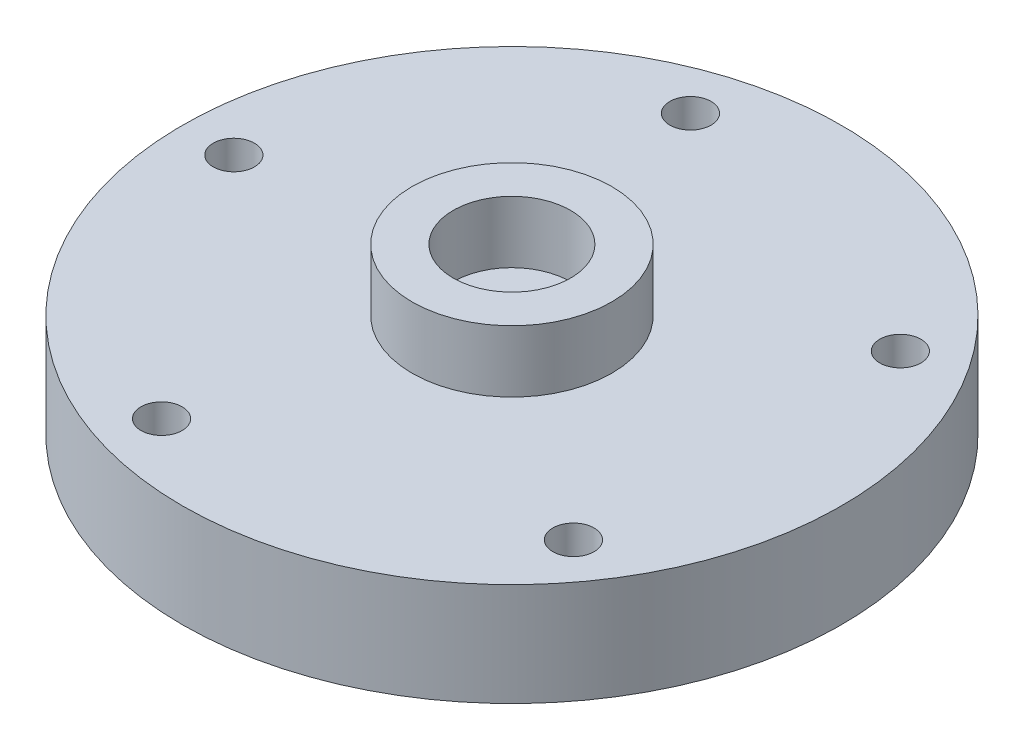
ISO-10303-21;
HEADER;
FILE_DESCRIPTION(('STEP AP214'),'2;1');
FILE_NAME('part.step','',(''),(''),'','','');
FILE_SCHEMA(('AUTOMOTIVE_DESIGN { 1 0 10303 214 1 1 1 1 }'));
ENDSEC;
DATA;
#1=APPLICATION_CONTEXT('core data for automotive mechanical design processes');
#2=APPLICATION_PROTOCOL_DEFINITION('international standard','automotive_design',2000,#1);
#3=PRODUCT_CONTEXT('',#1,'mechanical');
#4=PRODUCT('Part','Part','',(#3));
#5=PRODUCT_RELATED_PRODUCT_CATEGORY('part','',(#4));
#6=PRODUCT_DEFINITION_FORMATION('','',#4);
#7=PRODUCT_DEFINITION_CONTEXT('part definition',#1,'design');
#8=PRODUCT_DEFINITION('design','',#6,#7);
#9=PRODUCT_DEFINITION_SHAPE('','',#8);
#10=(LENGTH_UNIT() NAMED_UNIT(*) SI_UNIT(.MILLI.,.METRE.));
#11=(NAMED_UNIT(*) PLANE_ANGLE_UNIT() SI_UNIT($,.RADIAN.));
#12=(NAMED_UNIT(*) SI_UNIT($,.STERADIAN.) SOLID_ANGLE_UNIT());
#13=UNCERTAINTY_MEASURE_WITH_UNIT(LENGTH_MEASURE(1.E-05),#10,'distance_accuracy_value','');
#14=(GEOMETRIC_REPRESENTATION_CONTEXT(3) GLOBAL_UNCERTAINTY_ASSIGNED_CONTEXT((#13)) GLOBAL_UNIT_ASSIGNED_CONTEXT((#10,
#11,#12)) REPRESENTATION_CONTEXT('',''));
#15=CARTESIAN_POINT('',(0.,0.,0.));
#16=DIRECTION('',(0.,0.,1.));
#17=DIRECTION('',(1.,0.,0.));
#18=AXIS2_PLACEMENT_3D('',#15,#16,#17);
#19=CARTESIAN_POINT('',(0.,-3.,0.));
#20=DIRECTION('',(0.,1.,0.));
#21=DIRECTION('',(0.,0.,1.));
#22=AXIS2_PLACEMENT_3D('',#19,#20,#21);
#23=CYLINDRICAL_SURFACE('',#22,1.);
#24=CARTESIAN_POINT('',(0.,2.,0.));
#25=DIRECTION('',(0.,1.,0.));
#26=DIRECTION('',(0.,0.,1.));
#27=AXIS2_PLACEMENT_3D('',#24,#25,#26);
#28=CIRCLE('',#27,1.);
#29=CARTESIAN_POINT('',(0.,2.,1.));
#30=VERTEX_POINT('',#29);
#31=EDGE_CURVE('E79',#30,#30,#28,.T.);
#32=ORIENTED_EDGE('',*,*,#31,.T.);
#33=EDGE_LOOP('',(#32));
#34=FACE_BOUND('',#33,.T.);
#35=CARTESIAN_POINT('',(0.,-2.,0.));
#36=DIRECTION('',(0.,-1.,0.));
#37=DIRECTION('',(0.,0.,-1.));
#38=AXIS2_PLACEMENT_3D('',#35,#36,#37);
#39=CIRCLE('',#38,1.);
#40=CARTESIAN_POINT('',(0.,-2.,-1.));
#41=VERTEX_POINT('',#40);
#42=EDGE_CURVE('E36',#41,#41,#39,.F.);
#43=ORIENTED_EDGE('',*,*,#42,.F.);
#44=EDGE_LOOP('',(#43));
#45=FACE_BOUND('',#44,.T.);
#46=ADVANCED_FACE('F33',(#34,#45),#23,.F.);
#47=CARTESIAN_POINT('',(0.,2.,0.));
#48=DIRECTION('',(0.,1.,0.));
#49=DIRECTION('',(0.,0.,1.));
#50=AXIS2_PLACEMENT_3D('',#47,#48,#49);
#51=PLANE('',#50);
#52=ORIENTED_EDGE('',*,*,#31,.F.);
#53=EDGE_LOOP('',(#52));
#54=FACE_BOUND('',#53,.T.);
#55=CARTESIAN_POINT('',(0.,2.,0.));
#56=DIRECTION('',(0.,1.,0.));
#57=DIRECTION('',(0.,0.,1.));
#58=AXIS2_PLACEMENT_3D('',#55,#56,#57);
#59=CIRCLE('',#58,2.85);
#60=CARTESIAN_POINT('',(0.,2.,2.85));
#61=VERTEX_POINT('',#60);
#62=EDGE_CURVE('E10',#61,#61,#59,.F.);
#63=ORIENTED_EDGE('',*,*,#62,.F.);
#64=EDGE_LOOP('',(#63));
#65=FACE_BOUND('',#64,.T.);
#66=ADVANCED_FACE('F104',(#54,#65),#51,.T.);
#67=CARTESIAN_POINT('',(10.9217294240618,-3.,7.93510090594839));
#68=DIRECTION('',(0.,1.,0.));
#69=DIRECTION('',(0.,0.,1.));
#70=AXIS2_PLACEMENT_3D('',#67,#68,#69);
#71=CYLINDRICAL_SURFACE('',#70,1.);
#72=CARTESIAN_POINT('',(10.9217294240618,-3.,7.93510090594839));
#73=DIRECTION('',(0.,1.,0.));
#74=DIRECTION('',(0.,0.,1.));
#75=AXIS2_PLACEMENT_3D('',#72,#73,#74);
#76=CIRCLE('',#75,1.);
#77=CARTESIAN_POINT('',(10.9217294240618,-3.,8.93510090594839));
#78=VERTEX_POINT('',#77);
#79=EDGE_CURVE('E44',#78,#78,#76,.T.);
#80=ORIENTED_EDGE('',*,*,#79,.F.);
#81=EDGE_LOOP('',(#80));
#82=FACE_BOUND('',#81,.T.);
#83=CARTESIAN_POINT('',(10.9217294240618,2.,7.93510090594839));
#84=DIRECTION('',(0.,1.,0.));
#85=DIRECTION('',(0.,0.,1.));
#86=AXIS2_PLACEMENT_3D('',#83,#84,#85);
#87=CIRCLE('',#86,1.);
#88=CARTESIAN_POINT('',(10.9217294240618,2.,8.93510090594839));
#89=VERTEX_POINT('',#88);
#90=EDGE_CURVE('E64',#89,#89,#87,.T.);
#91=ORIENTED_EDGE('',*,*,#90,.T.);
#92=EDGE_LOOP('',(#91));
#93=FACE_BOUND('',#92,.T.);
#94=ADVANCED_FACE('F109',(#82,#93),#71,.F.);
#95=CARTESIAN_POINT('',(10.9217294240618,-3.,-7.93510090594839));
#96=DIRECTION('',(0.,1.,0.));
#97=DIRECTION('',(0.,0.,1.));
#98=AXIS2_PLACEMENT_3D('',#95,#96,#97);
#99=CYLINDRICAL_SURFACE('',#98,1.);
#100=CARTESIAN_POINT('',(10.9217294240618,-3.,-7.93510090594839));
#101=DIRECTION('',(0.,1.,0.));
#102=DIRECTION('',(0.,0.,1.));
#103=AXIS2_PLACEMENT_3D('',#100,#101,#102);
#104=CIRCLE('',#103,1.);
#105=CARTESIAN_POINT('',(10.9217294240618,-3.,-6.93510090594839));
#106=VERTEX_POINT('',#105);
#107=EDGE_CURVE('E49',#106,#106,#104,.T.);
#108=ORIENTED_EDGE('',*,*,#107,.F.);
#109=EDGE_LOOP('',(#108));
#110=FACE_BOUND('',#109,.T.);
#111=CARTESIAN_POINT('',(10.9217294240618,2.,-7.93510090594839));
#112=DIRECTION('',(0.,1.,0.));
#113=DIRECTION('',(0.,0.,1.));
#114=AXIS2_PLACEMENT_3D('',#111,#112,#113);
#115=CIRCLE('',#114,1.);
#116=CARTESIAN_POINT('',(10.9217294240618,2.,-6.93510090594839));
#117=VERTEX_POINT('',#116);
#118=EDGE_CURVE('E67',#117,#117,#115,.T.);
#119=ORIENTED_EDGE('',*,*,#118,.T.);
#120=EDGE_LOOP('',(#119));
#121=FACE_BOUND('',#120,.T.);
#122=ADVANCED_FACE('F118',(#110,#121),#99,.F.);
#123=CARTESIAN_POINT('',(-4.17172942406179,-3.,-12.8392629699846));
#124=DIRECTION('',(0.,1.,0.));
#125=DIRECTION('',(0.,0.,1.));
#126=AXIS2_PLACEMENT_3D('',#123,#124,#125);
#127=CYLINDRICAL_SURFACE('',#126,1.);
#128=CARTESIAN_POINT('',(-4.17172942406179,-3.,-12.8392629699846));
#129=DIRECTION('',(0.,1.,0.));
#130=DIRECTION('',(0.,0.,1.));
#131=AXIS2_PLACEMENT_3D('',#128,#129,#130);
#132=CIRCLE('',#131,1.);
#133=CARTESIAN_POINT('',(-4.17172942406179,-3.,-11.8392629699846));
#134=VERTEX_POINT('',#133);
#135=EDGE_CURVE('E52',#134,#134,#132,.T.);
#136=ORIENTED_EDGE('',*,*,#135,.F.);
#137=EDGE_LOOP('',(#136));
#138=FACE_BOUND('',#137,.T.);
#139=CARTESIAN_POINT('',(-4.17172942406179,2.,-12.8392629699846));
#140=DIRECTION('',(0.,1.,0.));
#141=DIRECTION('',(0.,0.,1.));
#142=AXIS2_PLACEMENT_3D('',#139,#140,#141);
#143=CIRCLE('',#142,1.);
#144=CARTESIAN_POINT('',(-4.17172942406179,2.,-11.8392629699846));
#145=VERTEX_POINT('',#144);
#146=EDGE_CURVE('E70',#145,#145,#143,.T.);
#147=ORIENTED_EDGE('',*,*,#146,.T.);
#148=EDGE_LOOP('',(#147));
#149=FACE_BOUND('',#148,.T.);
#150=ADVANCED_FACE('F161',(#138,#149),#127,.F.);
#151=CARTESIAN_POINT('',(-13.5,-3.,0.));
#152=DIRECTION('',(0.,1.,0.));
#153=DIRECTION('',(0.,0.,1.));
#154=AXIS2_PLACEMENT_3D('',#151,#152,#153);
#155=CYLINDRICAL_SURFACE('',#154,1.);
#156=CARTESIAN_POINT('',(-13.5,-3.,0.));
#157=DIRECTION('',(0.,1.,0.));
#158=DIRECTION('',(0.,0.,1.));
#159=AXIS2_PLACEMENT_3D('',#156,#157,#158);
#160=CIRCLE('',#159,1.);
#161=CARTESIAN_POINT('',(-13.5,-3.,1.));
#162=VERTEX_POINT('',#161);
#163=EDGE_CURVE('E55',#162,#162,#160,.T.);
#164=ORIENTED_EDGE('',*,*,#163,.F.);
#165=EDGE_LOOP('',(#164));
#166=FACE_BOUND('',#165,.T.);
#167=CARTESIAN_POINT('',(-13.5,2.,0.));
#168=DIRECTION('',(0.,1.,0.));
#169=DIRECTION('',(0.,0.,1.));
#170=AXIS2_PLACEMENT_3D('',#167,#168,#169);
#171=CIRCLE('',#170,1.);
#172=CARTESIAN_POINT('',(-13.5,2.,1.));
#173=VERTEX_POINT('',#172);
#174=EDGE_CURVE('E73',#173,#173,#171,.T.);
#175=ORIENTED_EDGE('',*,*,#174,.T.);
#176=EDGE_LOOP('',(#175));
#177=FACE_BOUND('',#176,.T.);
#178=ADVANCED_FACE('F156',(#166,#177),#155,.F.);
#179=CARTESIAN_POINT('',(-4.17172942406179,-3.,12.8392629699846));
#180=DIRECTION('',(0.,1.,0.));
#181=DIRECTION('',(0.,0.,1.));
#182=AXIS2_PLACEMENT_3D('',#179,#180,#181);
#183=CYLINDRICAL_SURFACE('',#182,1.);
#184=CARTESIAN_POINT('',(-4.17172942406179,-3.,12.8392629699846));
#185=DIRECTION('',(0.,1.,0.));
#186=DIRECTION('',(0.,0.,1.));
#187=AXIS2_PLACEMENT_3D('',#184,#185,#186);
#188=CIRCLE('',#187,1.);
#189=CARTESIAN_POINT('',(-4.17172942406179,-3.,13.8392629699846));
#190=VERTEX_POINT('',#189);
#191=EDGE_CURVE('E58',#190,#190,#188,.T.);
#192=ORIENTED_EDGE('',*,*,#191,.F.);
#193=EDGE_LOOP('',(#192));
#194=FACE_BOUND('',#193,.T.);
#195=CARTESIAN_POINT('',(-4.17172942406179,2.,12.8392629699846));
#196=DIRECTION('',(0.,1.,0.));
#197=DIRECTION('',(0.,0.,1.));
#198=AXIS2_PLACEMENT_3D('',#195,#196,#197);
#199=CIRCLE('',#198,1.);
#200=CARTESIAN_POINT('',(-4.17172942406179,2.,13.8392629699846));
#201=VERTEX_POINT('',#200);
#202=EDGE_CURVE('E76',#201,#201,#199,.T.);
#203=ORIENTED_EDGE('',*,*,#202,.T.);
#204=EDGE_LOOP('',(#203));
#205=FACE_BOUND('',#204,.T.);
#206=ADVANCED_FACE('F150',(#194,#205),#183,.F.);
#207=CARTESIAN_POINT('',(0.,-3.,0.));
#208=DIRECTION('',(0.,1.,0.));
#209=DIRECTION('',(0.,0.,1.));
#210=AXIS2_PLACEMENT_3D('',#207,#208,#209);
#211=CYLINDRICAL_SURFACE('',#210,16.);
#212=CARTESIAN_POINT('',(0.,-3.,0.));
#213=DIRECTION('',(0.,1.,0.));
#214=DIRECTION('',(0.,0.,1.));
#215=AXIS2_PLACEMENT_3D('',#212,#213,#214);
#216=CIRCLE('',#215,16.);
#217=CARTESIAN_POINT('',(0.,-3.,16.));
#218=VERTEX_POINT('',#217);
#219=EDGE_CURVE('E40',#218,#218,#216,.T.);
#220=ORIENTED_EDGE('',*,*,#219,.T.);
#221=EDGE_LOOP('',(#220));
#222=FACE_BOUND('',#221,.T.);
#223=CARTESIAN_POINT('',(0.,2.,0.));
#224=DIRECTION('',(0.,1.,0.));
#225=DIRECTION('',(0.,0.,1.));
#226=AXIS2_PLACEMENT_3D('',#223,#224,#225);
#227=CIRCLE('',#226,16.);
#228=CARTESIAN_POINT('',(0.,2.,16.));
#229=VERTEX_POINT('',#228);
#230=EDGE_CURVE('E61',#229,#229,#227,.T.);
#231=ORIENTED_EDGE('',*,*,#230,.F.);
#232=EDGE_LOOP('',(#231));
#233=FACE_BOUND('',#232,.T.);
#234=ADVANCED_FACE('F133',(#222,#233),#211,.T.);
#235=CARTESIAN_POINT('',(0.,-3.,0.));
#236=DIRECTION('',(0.,1.,0.));
#237=DIRECTION('',(0.,0.,1.));
#238=AXIS2_PLACEMENT_3D('',#235,#236,#237);
#239=PLANE('',#238);
#240=CARTESIAN_POINT('',(0.,-3.,0.));
#241=DIRECTION('',(0.,-1.,0.));
#242=DIRECTION('',(0.,0.,-1.));
#243=AXIS2_PLACEMENT_3D('',#240,#241,#242);
#244=CIRCLE('',#243,2.);
#245=CARTESIAN_POINT('',(0.,-3.,-2.));
#246=VERTEX_POINT('',#245);
#247=EDGE_CURVE('E91',#246,#246,#244,.T.);
#248=ORIENTED_EDGE('',*,*,#247,.F.);
#249=EDGE_LOOP('',(#248));
#250=FACE_BOUND('',#249,.T.);
#251=ORIENTED_EDGE('',*,*,#191,.T.);
#252=EDGE_LOOP('',(#251));
#253=FACE_BOUND('',#252,.T.);
#254=ORIENTED_EDGE('',*,*,#163,.T.);
#255=EDGE_LOOP('',(#254));
#256=FACE_BOUND('',#255,.T.);
#257=ORIENTED_EDGE('',*,*,#135,.T.);
#258=EDGE_LOOP('',(#257));
#259=FACE_BOUND('',#258,.T.);
#260=ORIENTED_EDGE('',*,*,#107,.T.);
#261=EDGE_LOOP('',(#260));
#262=FACE_BOUND('',#261,.T.);
#263=ORIENTED_EDGE('',*,*,#79,.T.);
#264=EDGE_LOOP('',(#263));
#265=FACE_BOUND('',#264,.T.);
#266=ORIENTED_EDGE('',*,*,#219,.F.);
#267=EDGE_LOOP('',(#266));
#268=FACE_BOUND('',#267,.T.);
#269=ADVANCED_FACE('F125',(#250,#253,#256,#259,#262,#265,#268),#239,.F.);
#270=CARTESIAN_POINT('',(0.,2.,0.));
#271=DIRECTION('',(0.,1.,0.));
#272=DIRECTION('',(0.,0.,1.));
#273=AXIS2_PLACEMENT_3D('',#270,#271,#272);
#274=CIRCLE('',#273,4.85);
#275=CARTESIAN_POINT('',(0.,2.,4.85));
#276=VERTEX_POINT('',#275);
#277=EDGE_CURVE('E83',#276,#276,#274,.T.);
#278=ORIENTED_EDGE('',*,*,#277,.F.);
#279=EDGE_LOOP('',(#278));
#280=FACE_BOUND('',#279,.T.);
#281=ORIENTED_EDGE('',*,*,#202,.F.);
#282=EDGE_LOOP('',(#281));
#283=FACE_BOUND('',#282,.T.);
#284=ORIENTED_EDGE('',*,*,#174,.F.);
#285=EDGE_LOOP('',(#284));
#286=FACE_BOUND('',#285,.T.);
#287=ORIENTED_EDGE('',*,*,#146,.F.);
#288=EDGE_LOOP('',(#287));
#289=FACE_BOUND('',#288,.T.);
#290=ORIENTED_EDGE('',*,*,#118,.F.);
#291=EDGE_LOOP('',(#290));
#292=FACE_BOUND('',#291,.T.);
#293=ORIENTED_EDGE('',*,*,#90,.F.);
#294=EDGE_LOOP('',(#293));
#295=FACE_BOUND('',#294,.T.);
#296=ORIENTED_EDGE('',*,*,#230,.T.);
#297=EDGE_LOOP('',(#296));
#298=FACE_BOUND('',#297,.T.);
#299=ADVANCED_FACE('F112',(#280,#283,#286,#289,#292,#295,#298),#51,.T.);
#300=CARTESIAN_POINT('',(0.,5.,0.));
#301=DIRECTION('',(0.,-1.,0.));
#302=DIRECTION('',(0.,0.,-1.));
#303=AXIS2_PLACEMENT_3D('',#300,#301,#302);
#304=CYLINDRICAL_SURFACE('',#303,2.85);
#305=CARTESIAN_POINT('',(0.,5.,0.));
#306=DIRECTION('',(0.,1.,0.));
#307=DIRECTION('',(0.,0.,1.));
#308=AXIS2_PLACEMENT_3D('',#305,#306,#307);
#309=CIRCLE('',#308,2.85);
#310=CARTESIAN_POINT('',(0.,5.,2.85));
#311=VERTEX_POINT('',#310);
#312=EDGE_CURVE('E86',#311,#311,#309,.T.);
#313=ORIENTED_EDGE('',*,*,#312,.T.);
#314=EDGE_LOOP('',(#313));
#315=FACE_BOUND('',#314,.T.);
#316=ORIENTED_EDGE('',*,*,#62,.T.);
#317=EDGE_LOOP('',(#316));
#318=FACE_BOUND('',#317,.T.);
#319=ADVANCED_FACE('F124',(#315,#318),#304,.F.);
#320=CARTESIAN_POINT('',(0.,5.,0.));
#321=DIRECTION('',(0.,-1.,0.));
#322=DIRECTION('',(0.,0.,-1.));
#323=AXIS2_PLACEMENT_3D('',#320,#321,#322);
#324=CYLINDRICAL_SURFACE('',#323,4.85);
#325=CARTESIAN_POINT('',(0.,5.,0.));
#326=DIRECTION('',(0.,1.,0.));
#327=DIRECTION('',(0.,0.,1.));
#328=AXIS2_PLACEMENT_3D('',#325,#326,#327);
#329=CIRCLE('',#328,4.85);
#330=CARTESIAN_POINT('',(0.,5.,4.85));
#331=VERTEX_POINT('',#330);
#332=EDGE_CURVE('E82',#331,#331,#329,.T.);
#333=ORIENTED_EDGE('',*,*,#332,.F.);
#334=EDGE_LOOP('',(#333));
#335=FACE_BOUND('',#334,.T.);
#336=ORIENTED_EDGE('',*,*,#277,.T.);
#337=EDGE_LOOP('',(#336));
#338=FACE_BOUND('',#337,.T.);
#339=ADVANCED_FACE('F131',(#335,#338),#324,.T.);
#340=CARTESIAN_POINT('',(0.,5.,0.));
#341=DIRECTION('',(0.,1.,0.));
#342=DIRECTION('',(0.,0.,1.));
#343=AXIS2_PLACEMENT_3D('',#340,#341,#342);
#344=PLANE('',#343);
#345=ORIENTED_EDGE('',*,*,#312,.F.);
#346=EDGE_LOOP('',(#345));
#347=FACE_BOUND('',#346,.T.);
#348=ORIENTED_EDGE('',*,*,#332,.T.);
#349=EDGE_LOOP('',(#348));
#350=FACE_BOUND('',#349,.T.);
#351=ADVANCED_FACE('F221',(#347,#350),#344,.T.);
#352=CARTESIAN_POINT('',(0.,-2.,0.));
#353=DIRECTION('',(0.,-1.,0.));
#354=DIRECTION('',(0.,0.,-1.));
#355=AXIS2_PLACEMENT_3D('',#352,#353,#354);
#356=PLANE('',#355);
#357=CARTESIAN_POINT('',(0.,-2.,0.));
#358=DIRECTION('',(0.,-1.,0.));
#359=DIRECTION('',(0.,0.,-1.));
#360=AXIS2_PLACEMENT_3D('',#357,#358,#359);
#361=CIRCLE('',#360,2.);
#362=CARTESIAN_POINT('',(0.,-2.,-2.));
#363=VERTEX_POINT('',#362);
#364=EDGE_CURVE('E94',#363,#363,#361,.T.);
#365=ORIENTED_EDGE('',*,*,#364,.T.);
#366=EDGE_LOOP('',(#365));
#367=FACE_BOUND('',#366,.T.);
#368=ORIENTED_EDGE('',*,*,#42,.T.);
#369=EDGE_LOOP('',(#368));
#370=FACE_BOUND('',#369,.T.);
#371=ADVANCED_FACE('F101',(#367,#370),#356,.T.);
#372=CARTESIAN_POINT('',(0.,-2.,0.));
#373=DIRECTION('',(0.,-1.,0.));
#374=DIRECTION('',(0.,0.,-1.));
#375=AXIS2_PLACEMENT_3D('',#372,#373,#374);
#376=CYLINDRICAL_SURFACE('',#375,2.);
#377=ORIENTED_EDGE('',*,*,#364,.F.);
#378=EDGE_LOOP('',(#377));
#379=FACE_BOUND('',#378,.T.);
#380=ORIENTED_EDGE('',*,*,#247,.T.);
#381=EDGE_LOOP('',(#380));
#382=FACE_BOUND('',#381,.T.);
#383=ADVANCED_FACE('F252',(#379,#382),#376,.F.);
#384=CLOSED_SHELL('',(#46,#66,#94,#122,#150,#178,#206,#234,#269,#299,#319,#339,#351,#371,#383));
#385=MANIFOLD_SOLID_BREP('B2',#384);
#386=ADVANCED_BREP_SHAPE_REPRESENTATION('',(#18,#385),#14);
#387=SHAPE_DEFINITION_REPRESENTATION(#9,#386);
ENDSEC;
END-ISO-10303-21;
